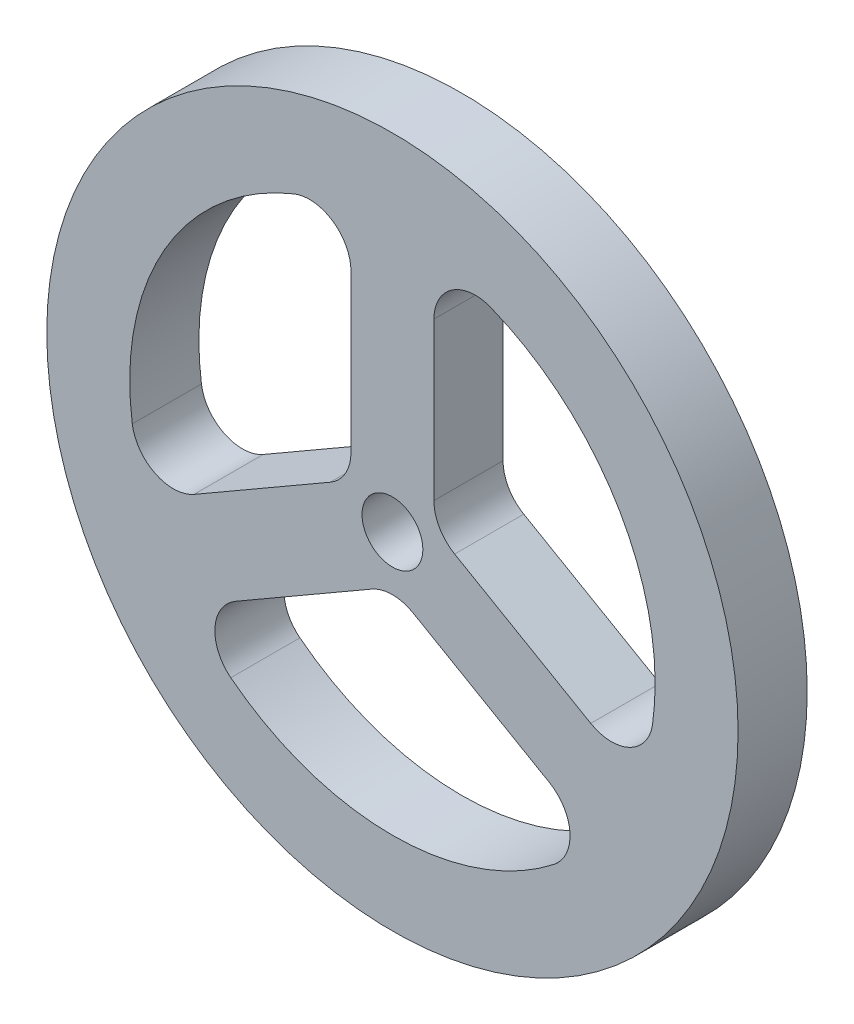
ISO-10303-21;
HEADER;
FILE_DESCRIPTION(('STEP AP214'),'2;1');
FILE_NAME('part.step','',(''),(''),'','','');
FILE_SCHEMA(('AUTOMOTIVE_DESIGN { 1 0 10303 214 1 1 1 1 }'));
ENDSEC;
DATA;
#1=APPLICATION_CONTEXT('core data for automotive mechanical design processes');
#2=APPLICATION_PROTOCOL_DEFINITION('international standard','automotive_design',2000,#1);
#3=PRODUCT_CONTEXT('',#1,'mechanical');
#4=PRODUCT('Part','Part','',(#3));
#5=PRODUCT_RELATED_PRODUCT_CATEGORY('part','',(#4));
#6=PRODUCT_DEFINITION_FORMATION('','',#4);
#7=PRODUCT_DEFINITION_CONTEXT('part definition',#1,'design');
#8=PRODUCT_DEFINITION('design','',#6,#7);
#9=PRODUCT_DEFINITION_SHAPE('','',#8);
#10=(LENGTH_UNIT() NAMED_UNIT(*) SI_UNIT(.MILLI.,.METRE.));
#11=(NAMED_UNIT(*) PLANE_ANGLE_UNIT() SI_UNIT($,.RADIAN.));
#12=(NAMED_UNIT(*) SI_UNIT($,.STERADIAN.) SOLID_ANGLE_UNIT());
#13=UNCERTAINTY_MEASURE_WITH_UNIT(LENGTH_MEASURE(1.E-05),#10,'distance_accuracy_value','');
#14=(GEOMETRIC_REPRESENTATION_CONTEXT(3) GLOBAL_UNCERTAINTY_ASSIGNED_CONTEXT((#13)) GLOBAL_UNIT_ASSIGNED_CONTEXT((#10,
#11,#12)) REPRESENTATION_CONTEXT('',''));
#15=CARTESIAN_POINT('',(0.,0.,0.));
#16=DIRECTION('',(0.,0.,1.));
#17=DIRECTION('',(1.,0.,0.));
#18=AXIS2_PLACEMENT_3D('',#15,#16,#17);
#19=CARTESIAN_POINT('',(0.,0.,6.35));
#20=DIRECTION('',(0.,0.,-1.));
#21=DIRECTION('',(-1.,0.,0.));
#22=AXIS2_PLACEMENT_3D('',#19,#20,#21);
#23=CYLINDRICAL_SURFACE('',#22,24.13);
#24=CARTESIAN_POINT('',(0.,0.,0.));
#25=DIRECTION('',(0.,0.,1.));
#26=DIRECTION('',(1.,0.,0.));
#27=AXIS2_PLACEMENT_3D('',#24,#25,#26);
#28=CIRCLE('',#27,24.13);
#29=CARTESIAN_POINT('',(-14.8478413826994,-19.0210017158456,0.));
#30=VERTEX_POINT('',#29);
#31=CARTESIAN_POINT('',(14.8478413826994,-19.0210017158456,0.));
#32=VERTEX_POINT('',#31);
#33=EDGE_CURVE('E206',#30,#32,#28,.T.);
#34=ORIENTED_EDGE('',*,*,#33,.F.);
#35=DIRECTION('',(0.,0.,-1.));
#36=VECTOR('',#35,1.);
#37=CARTESIAN_POINT('',(-14.8478413826994,-19.0210017158456,6.35));
#38=LINE('',#37,#36);
#39=CARTESIAN_POINT('',(-14.8478413826994,-19.0210017158456,6.35));
#40=VERTEX_POINT('',#39);
#41=EDGE_CURVE('E226',#30,#40,#38,.F.);
#42=ORIENTED_EDGE('',*,*,#41,.T.);
#43=CARTESIAN_POINT('',(0.,0.,6.35));
#44=DIRECTION('',(0.,0.,1.));
#45=DIRECTION('',(1.,0.,0.));
#46=AXIS2_PLACEMENT_3D('',#43,#44,#45);
#47=CIRCLE('',#46,24.13);
#48=CARTESIAN_POINT('',(14.8478413826994,-19.0210017158456,6.35));
#49=VERTEX_POINT('',#48);
#50=EDGE_CURVE('E348',#40,#49,#47,.T.);
#51=ORIENTED_EDGE('',*,*,#50,.T.);
#52=DIRECTION('',(0.,0.,-1.));
#53=VECTOR('',#52,1.);
#54=CARTESIAN_POINT('',(14.8478413826994,-19.0210017158456,6.35));
#55=LINE('',#54,#53);
#56=EDGE_CURVE('E222',#49,#32,#55,.T.);
#57=ORIENTED_EDGE('',*,*,#56,.T.);
#58=EDGE_LOOP('',(#34,#42,#51,#57));
#59=FACE_BOUND('',#58,.T.);
#60=ADVANCED_FACE('F41',(#59),#23,.F.);
#61=CARTESIAN_POINT('',(1.905,-3.29955678841871,6.35));
#62=DIRECTION('',(0.5,-0.866025403784439,0.));
#63=DIRECTION('',(0.866025403784439,0.5,0.));
#64=AXIS2_PLACEMENT_3D('',#61,#62,#63);
#65=PLANE('',#64);
#66=DIRECTION('',(-0.866025403784439,-0.5,0.));
#67=VECTOR('',#66,1.);
#68=CARTESIAN_POINT('',(1.905,-3.29955678841871,0.));
#69=LINE('',#68,#67);
#70=CARTESIAN_POINT('',(-1.905,-5.49926131403119,0.));
#71=VERTEX_POINT('',#70);
#72=CARTESIAN_POINT('',(-14.4084453749047,-12.7181288670302,0.));
#73=VERTEX_POINT('',#72);
#74=EDGE_CURVE('E199',#71,#73,#69,.T.);
#75=ORIENTED_EDGE('',*,*,#74,.F.);
#76=DIRECTION('',(0.,0.,-1.));
#77=VECTOR('',#76,1.);
#78=CARTESIAN_POINT('',(-1.905,-5.49926131403118,6.35));
#79=LINE('',#78,#77);
#80=CARTESIAN_POINT('',(-1.905,-5.49926131403119,6.35));
#81=VERTEX_POINT('',#80);
#82=EDGE_CURVE('E173',#71,#81,#79,.F.);
#83=ORIENTED_EDGE('',*,*,#82,.T.);
#84=DIRECTION('',(-0.866025403784439,-0.5,0.));
#85=VECTOR('',#84,1.);
#86=CARTESIAN_POINT('',(1.905,-3.29955678841871,6.35));
#87=LINE('',#86,#85);
#88=CARTESIAN_POINT('',(-14.4084453749047,-12.7181288670302,6.35));
#89=VERTEX_POINT('',#88);
#90=EDGE_CURVE('E357',#81,#89,#87,.T.);
#91=ORIENTED_EDGE('',*,*,#90,.T.);
#92=DIRECTION('',(0.,0.,1.));
#93=VECTOR('',#92,1.);
#94=CARTESIAN_POINT('',(-14.4084453749047,-12.7181288670302,0.));
#95=LINE('',#94,#93);
#96=EDGE_CURVE('E190',#89,#73,#95,.F.);
#97=ORIENTED_EDGE('',*,*,#96,.T.);
#98=EDGE_LOOP('',(#75,#83,#91,#97));
#99=FACE_BOUND('',#98,.T.);
#100=ADVANCED_FACE('F399',(#99),#65,.T.);
#101=CARTESIAN_POINT('',(0.,0.,6.35));
#102=DIRECTION('',(0.,0.,-1.));
#103=DIRECTION('',(-1.,0.,0.));
#104=AXIS2_PLACEMENT_3D('',#101,#102,#103);
#105=CYLINDRICAL_SURFACE('',#104,24.13);
#106=CARTESIAN_POINT('',(0.,0.,6.35));
#107=DIRECTION('',(0.,0.,1.));
#108=DIRECTION('',(1.,0.,0.));
#109=AXIS2_PLACEMENT_3D('',#106,#107,#108);
#110=CIRCLE('',#109,24.13);
#111=CARTESIAN_POINT('',(23.8965913826993,-3.3481069708567,6.35));
#112=VERTEX_POINT('',#111);
#113=CARTESIAN_POINT('',(9.04875,22.3691086867023,6.35));
#114=VERTEX_POINT('',#113);
#115=EDGE_CURVE('E338',#112,#114,#110,.T.);
#116=ORIENTED_EDGE('',*,*,#115,.T.);
#117=DIRECTION('',(0.,0.,-1.));
#118=VECTOR('',#117,1.);
#119=CARTESIAN_POINT('',(9.04875,22.3691086867023,6.35));
#120=LINE('',#119,#118);
#121=CARTESIAN_POINT('',(9.04875,22.3691086867023,0.));
#122=VERTEX_POINT('',#121);
#123=EDGE_CURVE('E232',#114,#122,#120,.T.);
#124=ORIENTED_EDGE('',*,*,#123,.T.);
#125=CARTESIAN_POINT('',(0.,0.,0.));
#126=DIRECTION('',(0.,0.,1.));
#127=DIRECTION('',(1.,0.,0.));
#128=AXIS2_PLACEMENT_3D('',#125,#126,#127);
#129=CIRCLE('',#128,24.13);
#130=CARTESIAN_POINT('',(23.8965913826993,-3.3481069708567,0.));
#131=VERTEX_POINT('',#130);
#132=EDGE_CURVE('E316',#131,#122,#129,.T.);
#133=ORIENTED_EDGE('',*,*,#132,.F.);
#134=DIRECTION('',(0.,0.,-1.));
#135=VECTOR('',#134,1.);
#136=CARTESIAN_POINT('',(23.8965913826993,-3.3481069708567,6.35));
#137=LINE('',#136,#135);
#138=EDGE_CURVE('E229',#131,#112,#137,.F.);
#139=ORIENTED_EDGE('',*,*,#138,.T.);
#140=EDGE_LOOP('',(#116,#124,#133,#139));
#141=FACE_BOUND('',#140,.T.);
#142=ADVANCED_FACE('F324',(#141),#105,.F.);
#143=CARTESIAN_POINT('',(1.905,3.29955678841871,6.35));
#144=DIRECTION('',(0.5,0.866025403784439,0.));
#145=DIRECTION('',(-0.866025403784439,0.5,0.));
#146=AXIS2_PLACEMENT_3D('',#143,#144,#145);
#147=PLANE('',#146);
#148=DIRECTION('',(0.866025403784439,-0.5,0.));
#149=VECTOR('',#148,1.);
#150=CARTESIAN_POINT('',(1.905,3.29955678841871,0.));
#151=LINE('',#150,#149);
#152=CARTESIAN_POINT('',(5.715,1.09985226280624,0.));
#153=VERTEX_POINT('',#152);
#154=CARTESIAN_POINT('',(18.2184453749047,-6.11901529019278,0.));
#155=VERTEX_POINT('',#154);
#156=EDGE_CURVE('E318',#153,#155,#151,.T.);
#157=ORIENTED_EDGE('',*,*,#156,.F.);
#158=DIRECTION('',(0.,0.,-1.));
#159=VECTOR('',#158,1.);
#160=CARTESIAN_POINT('',(5.715,1.09985226280624,6.35));
#161=LINE('',#160,#159);
#162=CARTESIAN_POINT('',(5.715,1.09985226280624,6.35));
#163=VERTEX_POINT('',#162);
#164=EDGE_CURVE('E247',#153,#163,#161,.F.);
#165=ORIENTED_EDGE('',*,*,#164,.T.);
#166=DIRECTION('',(0.866025403784439,-0.5,0.));
#167=VECTOR('',#166,1.);
#168=CARTESIAN_POINT('',(1.905,3.29955678841871,6.35));
#169=LINE('',#168,#167);
#170=CARTESIAN_POINT('',(18.2184453749047,-6.11901529019278,6.35));
#171=VERTEX_POINT('',#170);
#172=EDGE_CURVE('E336',#163,#171,#169,.T.);
#173=ORIENTED_EDGE('',*,*,#172,.T.);
#174=DIRECTION('',(0.,0.,1.));
#175=VECTOR('',#174,1.);
#176=CARTESIAN_POINT('',(18.2184453749047,-6.11901529019278,0.));
#177=LINE('',#176,#175);
#178=EDGE_CURVE('E243',#171,#155,#177,.F.);
#179=ORIENTED_EDGE('',*,*,#178,.T.);
#180=EDGE_LOOP('',(#157,#165,#173,#179));
#181=FACE_BOUND('',#180,.T.);
#182=ADVANCED_FACE('F340',(#181),#147,.T.);
#183=CARTESIAN_POINT('',(0.,0.,6.35));
#184=DIRECTION('',(0.,0.,-1.));
#185=DIRECTION('',(-1.,0.,0.));
#186=AXIS2_PLACEMENT_3D('',#183,#184,#185);
#187=CYLINDRICAL_SURFACE('',#186,24.13);
#188=CARTESIAN_POINT('',(0.,0.,6.35));
#189=DIRECTION('',(0.,0.,1.));
#190=DIRECTION('',(1.,0.,0.));
#191=AXIS2_PLACEMENT_3D('',#188,#189,#190);
#192=CIRCLE('',#191,24.13);
#193=CARTESIAN_POINT('',(-9.04875,22.3691086867023,6.35));
#194=VERTEX_POINT('',#193);
#195=CARTESIAN_POINT('',(-23.8965913826993,-3.34810697085672,6.35));
#196=VERTEX_POINT('',#195);
#197=EDGE_CURVE('E213',#194,#196,#192,.T.);
#198=ORIENTED_EDGE('',*,*,#197,.T.);
#199=DIRECTION('',(0.,0.,-1.));
#200=VECTOR('',#199,1.);
#201=CARTESIAN_POINT('',(-23.8965913826993,-3.34810697085672,6.35));
#202=LINE('',#201,#200);
#203=CARTESIAN_POINT('',(-23.8965913826993,-3.34810697085672,0.));
#204=VERTEX_POINT('',#203);
#205=EDGE_CURVE('E253',#196,#204,#202,.T.);
#206=ORIENTED_EDGE('',*,*,#205,.T.);
#207=CARTESIAN_POINT('',(0.,0.,0.));
#208=DIRECTION('',(0.,0.,1.));
#209=DIRECTION('',(1.,0.,0.));
#210=AXIS2_PLACEMENT_3D('',#207,#208,#209);
#211=CIRCLE('',#210,24.13);
#212=CARTESIAN_POINT('',(-9.04875,22.3691086867023,0.));
#213=VERTEX_POINT('',#212);
#214=EDGE_CURVE('E370',#213,#204,#211,.T.);
#215=ORIENTED_EDGE('',*,*,#214,.F.);
#216=DIRECTION('',(0.,0.,-1.));
#217=VECTOR('',#216,1.);
#218=CARTESIAN_POINT('',(-9.04875,22.3691086867023,6.35));
#219=LINE('',#218,#217);
#220=EDGE_CURVE('E250',#213,#194,#219,.F.);
#221=ORIENTED_EDGE('',*,*,#220,.T.);
#222=EDGE_LOOP('',(#198,#206,#215,#221));
#223=FACE_BOUND('',#222,.T.);
#224=ADVANCED_FACE('F417',(#223),#187,.F.);
#225=CARTESIAN_POINT('',(-3.81,0.,6.35));
#226=DIRECTION('',(-1.,0.,0.));
#227=DIRECTION('',(0.,-1.,0.));
#228=AXIS2_PLACEMENT_3D('',#225,#226,#227);
#229=PLANE('',#228);
#230=DIRECTION('',(0.,1.,0.));
#231=VECTOR('',#230,1.);
#232=CARTESIAN_POINT('',(-3.81,0.,0.));
#233=LINE('',#232,#231);
#234=CARTESIAN_POINT('',(-3.81,4.39940905122495,0.));
#235=VERTEX_POINT('',#234);
#236=CARTESIAN_POINT('',(-3.81,18.837144157223,0.));
#237=VERTEX_POINT('',#236);
#238=EDGE_CURVE('E374',#235,#237,#233,.T.);
#239=ORIENTED_EDGE('',*,*,#238,.F.);
#240=DIRECTION('',(0.,0.,-1.));
#241=VECTOR('',#240,1.);
#242=CARTESIAN_POINT('',(-3.81,4.39940905122495,6.35));
#243=LINE('',#242,#241);
#244=CARTESIAN_POINT('',(-3.81,4.39940905122495,6.35));
#245=VERTEX_POINT('',#244);
#246=EDGE_CURVE('E64',#235,#245,#243,.F.);
#247=ORIENTED_EDGE('',*,*,#246,.T.);
#248=DIRECTION('',(0.,1.,0.));
#249=VECTOR('',#248,1.);
#250=CARTESIAN_POINT('',(-3.81,0.,6.35));
#251=LINE('',#250,#249);
#252=CARTESIAN_POINT('',(-3.81,18.837144157223,6.35));
#253=VERTEX_POINT('',#252);
#254=EDGE_CURVE('E630',#245,#253,#251,.T.);
#255=ORIENTED_EDGE('',*,*,#254,.T.);
#256=DIRECTION('',(0.,0.,1.));
#257=VECTOR('',#256,1.);
#258=CARTESIAN_POINT('',(-3.81,18.837144157223,0.));
#259=LINE('',#258,#257);
#260=EDGE_CURVE('E264',#253,#237,#259,.F.);
#261=ORIENTED_EDGE('',*,*,#260,.T.);
#262=EDGE_LOOP('',(#239,#247,#255,#261));
#263=FACE_BOUND('',#262,.T.);
#264=ADVANCED_FACE('F423',(#263),#229,.T.);
#265=CARTESIAN_POINT('',(0.,0.,6.35));
#266=DIRECTION('',(0.,0.,-1.));
#267=DIRECTION('',(-1.,0.,0.));
#268=AXIS2_PLACEMENT_3D('',#265,#266,#267);
#269=CYLINDRICAL_SURFACE('',#268,2.794);
#270=CARTESIAN_POINT('',(0.,0.,6.35));
#271=DIRECTION('',(0.,0.,1.));
#272=DIRECTION('',(1.,0.,0.));
#273=AXIS2_PLACEMENT_3D('',#270,#271,#272);
#274=CIRCLE('',#273,2.794);
#275=CARTESIAN_POINT('',(2.794,0.,6.35));
#276=VERTEX_POINT('',#275);
#277=EDGE_CURVE('E363',#276,#276,#274,.T.);
#278=ORIENTED_EDGE('',*,*,#277,.T.);
#279=EDGE_LOOP('',(#278));
#280=FACE_BOUND('',#279,.T.);
#281=CARTESIAN_POINT('',(0.,0.,0.));
#282=DIRECTION('',(0.,0.,1.));
#283=DIRECTION('',(1.,0.,0.));
#284=AXIS2_PLACEMENT_3D('',#281,#282,#283);
#285=CIRCLE('',#284,2.794);
#286=CARTESIAN_POINT('',(2.794,0.,0.));
#287=VERTEX_POINT('',#286);
#288=EDGE_CURVE('E198',#287,#287,#285,.T.);
#289=ORIENTED_EDGE('',*,*,#288,.F.);
#290=EDGE_LOOP('',(#289));
#291=FACE_BOUND('',#290,.T.);
#292=ADVANCED_FACE('F426',(#280,#291),#269,.F.);
#293=CARTESIAN_POINT('',(-1.905,-3.29955678841871,6.35));
#294=DIRECTION('',(0.5,0.866025403784439,0.));
#295=DIRECTION('',(-0.866025403784439,0.5,0.));
#296=AXIS2_PLACEMENT_3D('',#293,#294,#295);
#297=PLANE('',#296);
#298=DIRECTION('',(0.866025403784439,-0.5,0.));
#299=VECTOR('',#298,1.);
#300=CARTESIAN_POINT('',(-1.905,-3.29955678841871,6.35));
#301=LINE('',#300,#299);
#302=CARTESIAN_POINT('',(1.905,-5.49926131403118,6.35));
#303=VERTEX_POINT('',#302);
#304=CARTESIAN_POINT('',(14.4084453749047,-12.7181288670302,6.35));
#305=VERTEX_POINT('',#304);
#306=EDGE_CURVE('E188',#303,#305,#301,.T.);
#307=ORIENTED_EDGE('',*,*,#306,.F.);
#308=DIRECTION('',(0.,0.,-1.));
#309=VECTOR('',#308,1.);
#310=CARTESIAN_POINT('',(1.905,-5.49926131403118,6.35));
#311=LINE('',#310,#309);
#312=CARTESIAN_POINT('',(1.905,-5.49926131403118,0.));
#313=VERTEX_POINT('',#312);
#314=EDGE_CURVE('E172',#303,#313,#311,.T.);
#315=ORIENTED_EDGE('',*,*,#314,.T.);
#316=DIRECTION('',(0.866025403784439,-0.5,0.));
#317=VECTOR('',#316,1.);
#318=CARTESIAN_POINT('',(-1.905,-3.29955678841871,0.));
#319=LINE('',#318,#317);
#320=CARTESIAN_POINT('',(14.4084453749047,-12.7181288670302,0.));
#321=VERTEX_POINT('',#320);
#322=EDGE_CURVE('E185',#313,#321,#319,.T.);
#323=ORIENTED_EDGE('',*,*,#322,.T.);
#324=DIRECTION('',(0.,0.,-1.));
#325=VECTOR('',#324,1.);
#326=CARTESIAN_POINT('',(14.4084453749047,-12.7181288670302,6.35));
#327=LINE('',#326,#325);
#328=EDGE_CURVE('E191',#321,#305,#327,.F.);
#329=ORIENTED_EDGE('',*,*,#328,.T.);
#330=EDGE_LOOP('',(#307,#315,#323,#329));
#331=FACE_BOUND('',#330,.T.);
#332=ADVANCED_FACE('F184',(#331),#297,.F.);
#333=CARTESIAN_POINT('',(3.81,0.,6.35));
#334=DIRECTION('',(-1.,0.,0.));
#335=DIRECTION('',(0.,0.,1.));
#336=AXIS2_PLACEMENT_3D('',#333,#334,#335);
#337=PLANE('',#336);
#338=DIRECTION('',(0.,1.,0.));
#339=VECTOR('',#338,1.);
#340=CARTESIAN_POINT('',(3.81,0.,0.));
#341=LINE('',#340,#339);
#342=CARTESIAN_POINT('',(3.81,4.39940905122495,0.));
#343=VERTEX_POINT('',#342);
#344=CARTESIAN_POINT('',(3.81,18.837144157223,0.));
#345=VERTEX_POINT('',#344);
#346=EDGE_CURVE('E383',#343,#345,#341,.T.);
#347=ORIENTED_EDGE('',*,*,#346,.T.);
#348=DIRECTION('',(0.,0.,-1.));
#349=VECTOR('',#348,1.);
#350=CARTESIAN_POINT('',(3.81,18.837144157223,6.35));
#351=LINE('',#350,#349);
#352=CARTESIAN_POINT('',(3.81,18.837144157223,6.35));
#353=VERTEX_POINT('',#352);
#354=EDGE_CURVE('E240',#345,#353,#351,.F.);
#355=ORIENTED_EDGE('',*,*,#354,.T.);
#356=DIRECTION('',(0.,1.,0.));
#357=VECTOR('',#356,1.);
#358=CARTESIAN_POINT('',(3.81,0.,6.35));
#359=LINE('',#358,#357);
#360=CARTESIAN_POINT('',(3.81,4.39940905122495,6.35));
#361=VERTEX_POINT('',#360);
#362=EDGE_CURVE('E343',#361,#353,#359,.T.);
#363=ORIENTED_EDGE('',*,*,#362,.F.);
#364=DIRECTION('',(0.,0.,-1.));
#365=VECTOR('',#364,1.);
#366=CARTESIAN_POINT('',(3.81,4.39940905122495,6.35));
#367=LINE('',#366,#365);
#368=EDGE_CURVE('E236',#361,#343,#367,.T.);
#369=ORIENTED_EDGE('',*,*,#368,.T.);
#370=EDGE_LOOP('',(#347,#355,#363,#369));
#371=FACE_BOUND('',#370,.T.);
#372=ADVANCED_FACE('F411',(#371),#337,.F.);
#373=CARTESIAN_POINT('',(-1.905,3.29955678841871,6.35));
#374=DIRECTION('',(0.5,-0.866025403784438,0.));
#375=DIRECTION('',(0.866025403784439,0.5,0.));
#376=AXIS2_PLACEMENT_3D('',#373,#374,#375);
#377=PLANE('',#376);
#378=DIRECTION('',(-0.866025403784439,-0.5,0.));
#379=VECTOR('',#378,1.);
#380=CARTESIAN_POINT('',(-1.905,3.29955678841871,0.));
#381=LINE('',#380,#379);
#382=CARTESIAN_POINT('',(-5.715,1.09985226280624,0.));
#383=VERTEX_POINT('',#382);
#384=CARTESIAN_POINT('',(-18.2184453749047,-6.11901529019278,0.));
#385=VERTEX_POINT('',#384);
#386=EDGE_CURVE('E328',#383,#385,#381,.T.);
#387=ORIENTED_EDGE('',*,*,#386,.T.);
#388=DIRECTION('',(0.,0.,-1.));
#389=VECTOR('',#388,1.);
#390=CARTESIAN_POINT('',(-18.2184453749047,-6.11901529019278,6.35));
#391=LINE('',#390,#389);
#392=CARTESIAN_POINT('',(-18.2184453749047,-6.11901529019278,6.35));
#393=VERTEX_POINT('',#392);
#394=EDGE_CURVE('E261',#385,#393,#391,.F.);
#395=ORIENTED_EDGE('',*,*,#394,.T.);
#396=DIRECTION('',(-0.866025403784439,-0.5,0.));
#397=VECTOR('',#396,1.);
#398=CARTESIAN_POINT('',(-1.905,3.29955678841871,6.35));
#399=LINE('',#398,#397);
#400=CARTESIAN_POINT('',(-5.715,1.09985226280624,6.35));
#401=VERTEX_POINT('',#400);
#402=EDGE_CURVE('E350',#401,#393,#399,.T.);
#403=ORIENTED_EDGE('',*,*,#402,.F.);
#404=DIRECTION('',(0.,0.,-1.));
#405=VECTOR('',#404,1.);
#406=CARTESIAN_POINT('',(-5.715,1.09985226280624,6.35));
#407=LINE('',#406,#405);
#408=EDGE_CURVE('E257',#401,#383,#407,.T.);
#409=ORIENTED_EDGE('',*,*,#408,.T.);
#410=EDGE_LOOP('',(#387,#395,#403,#409));
#411=FACE_BOUND('',#410,.T.);
#412=ADVANCED_FACE('F414',(#411),#377,.F.);
#413=CARTESIAN_POINT('',(0.,0.,6.35));
#414=DIRECTION('',(0.,0.,-1.));
#415=DIRECTION('',(-1.,0.,0.));
#416=AXIS2_PLACEMENT_3D('',#413,#414,#415);
#417=CYLINDRICAL_SURFACE('',#416,31.75);
#418=CARTESIAN_POINT('',(0.,0.,6.35));
#419=DIRECTION('',(0.,0.,1.));
#420=DIRECTION('',(1.,0.,0.));
#421=AXIS2_PLACEMENT_3D('',#418,#419,#420);
#422=CIRCLE('',#421,31.75);
#423=CARTESIAN_POINT('',(31.75,0.,6.35));
#424=VERTEX_POINT('',#423);
#425=EDGE_CURVE('E215',#424,#424,#422,.T.);
#426=ORIENTED_EDGE('',*,*,#425,.F.);
#427=EDGE_LOOP('',(#426));
#428=FACE_BOUND('',#427,.T.);
#429=CARTESIAN_POINT('',(0.,0.,0.));
#430=DIRECTION('',(0.,0.,1.));
#431=DIRECTION('',(1.,0.,0.));
#432=AXIS2_PLACEMENT_3D('',#429,#430,#431);
#433=CIRCLE('',#432,31.75);
#434=CARTESIAN_POINT('',(31.75,0.,0.));
#435=VERTEX_POINT('',#434);
#436=EDGE_CURVE('E204',#435,#435,#433,.T.);
#437=ORIENTED_EDGE('',*,*,#436,.T.);
#438=EDGE_LOOP('',(#437));
#439=FACE_BOUND('',#438,.T.);
#440=ADVANCED_FACE('F421',(#428,#439),#417,.T.);
#441=CARTESIAN_POINT('',(0.,0.,6.35));
#442=DIRECTION('',(0.,0.,1.));
#443=DIRECTION('',(1.,0.,0.));
#444=AXIS2_PLACEMENT_3D('',#441,#442,#443);
#445=PLANE('',#444);
#446=ORIENTED_EDGE('',*,*,#197,.F.);
#447=CARTESIAN_POINT('',(-7.62,18.837144157223,6.35));
#448=DIRECTION('',(0.,0.,1.));
#449=DIRECTION('',(1.,0.,0.));
#450=AXIS2_PLACEMENT_3D('',#447,#448,#449);
#451=CIRCLE('',#450,3.81);
#452=EDGE_CURVE('E57',#194,#253,#451,.F.);
#453=ORIENTED_EDGE('',*,*,#452,.T.);
#454=ORIENTED_EDGE('',*,*,#254,.F.);
#455=CARTESIAN_POINT('',(-7.62,4.39940905122495,6.35));
#456=DIRECTION('',(0.,0.,1.));
#457=DIRECTION('',(1.,0.,0.));
#458=AXIS2_PLACEMENT_3D('',#455,#456,#457);
#459=CIRCLE('',#458,3.81);
#460=EDGE_CURVE('E299',#245,#401,#459,.F.);
#461=ORIENTED_EDGE('',*,*,#460,.T.);
#462=ORIENTED_EDGE('',*,*,#402,.T.);
#463=CARTESIAN_POINT('',(-20.1234453749047,-2.81945850177408,6.35));
#464=DIRECTION('',(0.,0.,1.));
#465=DIRECTION('',(1.,0.,0.));
#466=AXIS2_PLACEMENT_3D('',#463,#464,#465);
#467=CIRCLE('',#466,3.81);
#468=EDGE_CURVE('E293',#393,#196,#467,.F.);
#469=ORIENTED_EDGE('',*,*,#468,.T.);
#470=EDGE_LOOP('',(#446,#453,#454,#461,#462,#469));
#471=FACE_BOUND('',#470,.T.);
#472=ORIENTED_EDGE('',*,*,#115,.F.);
#473=CARTESIAN_POINT('',(20.1234453749047,-2.81945850177406,6.35));
#474=DIRECTION('',(0.,0.,1.));
#475=DIRECTION('',(1.,0.,0.));
#476=AXIS2_PLACEMENT_3D('',#473,#474,#475);
#477=CIRCLE('',#476,3.81);
#478=EDGE_CURVE('E11',#112,#171,#477,.F.);
#479=ORIENTED_EDGE('',*,*,#478,.T.);
#480=ORIENTED_EDGE('',*,*,#172,.F.);
#481=CARTESIAN_POINT('',(7.62,4.39940905122495,6.35));
#482=DIRECTION('',(0.,0.,1.));
#483=DIRECTION('',(1.,0.,0.));
#484=AXIS2_PLACEMENT_3D('',#481,#482,#483);
#485=CIRCLE('',#484,3.81);
#486=EDGE_CURVE('E287',#163,#361,#485,.F.);
#487=ORIENTED_EDGE('',*,*,#486,.T.);
#488=ORIENTED_EDGE('',*,*,#362,.T.);
#489=CARTESIAN_POINT('',(7.62,18.837144157223,6.35));
#490=DIRECTION('',(0.,0.,1.));
#491=DIRECTION('',(1.,0.,0.));
#492=AXIS2_PLACEMENT_3D('',#489,#490,#491);
#493=CIRCLE('',#492,3.81);
#494=EDGE_CURVE('E281',#353,#114,#493,.F.);
#495=ORIENTED_EDGE('',*,*,#494,.T.);
#496=EDGE_LOOP('',(#472,#479,#480,#487,#488,#495));
#497=FACE_BOUND('',#496,.T.);
#498=ORIENTED_EDGE('',*,*,#50,.F.);
#499=CARTESIAN_POINT('',(-12.5034453749047,-16.0176856554489,6.35));
#500=DIRECTION('',(0.,0.,1.));
#501=DIRECTION('',(1.,0.,0.));
#502=AXIS2_PLACEMENT_3D('',#499,#500,#501);
#503=CIRCLE('',#502,3.81);
#504=EDGE_CURVE('E275',#40,#89,#503,.F.);
#505=ORIENTED_EDGE('',*,*,#504,.T.);
#506=ORIENTED_EDGE('',*,*,#90,.F.);
#507=CARTESIAN_POINT('',(0.,-8.7988181024499,6.35));
#508=DIRECTION('',(0.,0.,1.));
#509=DIRECTION('',(1.,0.,0.));
#510=AXIS2_PLACEMENT_3D('',#507,#508,#509);
#511=CIRCLE('',#510,3.81);
#512=EDGE_CURVE('E179',#81,#303,#511,.F.);
#513=ORIENTED_EDGE('',*,*,#512,.T.);
#514=ORIENTED_EDGE('',*,*,#306,.T.);
#515=CARTESIAN_POINT('',(12.5034453749047,-16.0176856554489,6.35));
#516=DIRECTION('',(0.,0.,1.));
#517=DIRECTION('',(1.,0.,0.));
#518=AXIS2_PLACEMENT_3D('',#515,#516,#517);
#519=CIRCLE('',#518,3.81);
#520=EDGE_CURVE('E309',#305,#49,#519,.F.);
#521=ORIENTED_EDGE('',*,*,#520,.T.);
#522=EDGE_LOOP('',(#498,#505,#506,#513,#514,#521));
#523=FACE_BOUND('',#522,.T.);
#524=ORIENTED_EDGE('',*,*,#277,.F.);
#525=EDGE_LOOP('',(#524));
#526=FACE_BOUND('',#525,.T.);
#527=ORIENTED_EDGE('',*,*,#425,.T.);
#528=EDGE_LOOP('',(#527));
#529=FACE_BOUND('',#528,.T.);
#530=ADVANCED_FACE('F334',(#471,#497,#523,#526,#529),#445,.T.);
#531=CARTESIAN_POINT('',(0.,0.,0.));
#532=DIRECTION('',(0.,0.,1.));
#533=DIRECTION('',(1.,0.,0.));
#534=AXIS2_PLACEMENT_3D('',#531,#532,#533);
#535=PLANE('',#534);
#536=ORIENTED_EDGE('',*,*,#238,.T.);
#537=CARTESIAN_POINT('',(-7.62,18.837144157223,0.));
#538=DIRECTION('',(0.,0.,1.));
#539=DIRECTION('',(1.,0.,0.));
#540=AXIS2_PLACEMENT_3D('',#537,#538,#539);
#541=CIRCLE('',#540,3.81);
#542=EDGE_CURVE('E302',#237,#213,#541,.T.);
#543=ORIENTED_EDGE('',*,*,#542,.T.);
#544=ORIENTED_EDGE('',*,*,#214,.T.);
#545=CARTESIAN_POINT('',(-20.1234453749047,-2.81945850177408,0.));
#546=DIRECTION('',(0.,0.,1.));
#547=DIRECTION('',(1.,0.,0.));
#548=AXIS2_PLACEMENT_3D('',#545,#546,#547);
#549=CIRCLE('',#548,3.81);
#550=EDGE_CURVE('E290',#204,#385,#549,.T.);
#551=ORIENTED_EDGE('',*,*,#550,.T.);
#552=ORIENTED_EDGE('',*,*,#386,.F.);
#553=CARTESIAN_POINT('',(-7.62,4.39940905122495,0.));
#554=DIRECTION('',(0.,0.,1.));
#555=DIRECTION('',(1.,0.,0.));
#556=AXIS2_PLACEMENT_3D('',#553,#554,#555);
#557=CIRCLE('',#556,3.81);
#558=EDGE_CURVE('E296',#383,#235,#557,.T.);
#559=ORIENTED_EDGE('',*,*,#558,.T.);
#560=EDGE_LOOP('',(#536,#543,#544,#551,#552,#559));
#561=FACE_BOUND('',#560,.T.);
#562=ORIENTED_EDGE('',*,*,#156,.T.);
#563=CARTESIAN_POINT('',(20.1234453749047,-2.81945850177406,0.));
#564=DIRECTION('',(0.,0.,1.));
#565=DIRECTION('',(1.,0.,0.));
#566=AXIS2_PLACEMENT_3D('',#563,#564,#565);
#567=CIRCLE('',#566,3.81);
#568=EDGE_CURVE('E50',#155,#131,#567,.T.);
#569=ORIENTED_EDGE('',*,*,#568,.T.);
#570=ORIENTED_EDGE('',*,*,#132,.T.);
#571=CARTESIAN_POINT('',(7.62,18.837144157223,0.));
#572=DIRECTION('',(0.,0.,1.));
#573=DIRECTION('',(1.,0.,0.));
#574=AXIS2_PLACEMENT_3D('',#571,#572,#573);
#575=CIRCLE('',#574,3.81);
#576=EDGE_CURVE('E278',#122,#345,#575,.T.);
#577=ORIENTED_EDGE('',*,*,#576,.T.);
#578=ORIENTED_EDGE('',*,*,#346,.F.);
#579=CARTESIAN_POINT('',(7.62,4.39940905122495,0.));
#580=DIRECTION('',(0.,0.,1.));
#581=DIRECTION('',(1.,0.,0.));
#582=AXIS2_PLACEMENT_3D('',#579,#580,#581);
#583=CIRCLE('',#582,3.81);
#584=EDGE_CURVE('E284',#343,#153,#583,.T.);
#585=ORIENTED_EDGE('',*,*,#584,.T.);
#586=EDGE_LOOP('',(#562,#569,#570,#577,#578,#585));
#587=FACE_BOUND('',#586,.T.);
#588=ORIENTED_EDGE('',*,*,#74,.T.);
#589=CARTESIAN_POINT('',(-12.5034453749047,-16.0176856554489,0.));
#590=DIRECTION('',(0.,0.,1.));
#591=DIRECTION('',(1.,0.,0.));
#592=AXIS2_PLACEMENT_3D('',#589,#590,#591);
#593=CIRCLE('',#592,3.81);
#594=EDGE_CURVE('E272',#73,#30,#593,.T.);
#595=ORIENTED_EDGE('',*,*,#594,.T.);
#596=ORIENTED_EDGE('',*,*,#33,.T.);
#597=CARTESIAN_POINT('',(12.5034453749047,-16.0176856554489,0.));
#598=DIRECTION('',(0.,0.,1.));
#599=DIRECTION('',(1.,0.,0.));
#600=AXIS2_PLACEMENT_3D('',#597,#598,#599);
#601=CIRCLE('',#600,3.81);
#602=EDGE_CURVE('E196',#32,#321,#601,.T.);
#603=ORIENTED_EDGE('',*,*,#602,.T.);
#604=ORIENTED_EDGE('',*,*,#322,.F.);
#605=CARTESIAN_POINT('',(0.,-8.7988181024499,0.));
#606=DIRECTION('',(0.,0.,1.));
#607=DIRECTION('',(1.,0.,0.));
#608=AXIS2_PLACEMENT_3D('',#605,#606,#607);
#609=CIRCLE('',#608,3.81);
#610=EDGE_CURVE('E168',#313,#71,#609,.T.);
#611=ORIENTED_EDGE('',*,*,#610,.T.);
#612=EDGE_LOOP('',(#588,#595,#596,#603,#604,#611));
#613=FACE_BOUND('',#612,.T.);
#614=ORIENTED_EDGE('',*,*,#288,.T.);
#615=EDGE_LOOP('',(#614));
#616=FACE_BOUND('',#615,.T.);
#617=ORIENTED_EDGE('',*,*,#436,.F.);
#618=EDGE_LOOP('',(#617));
#619=FACE_BOUND('',#618,.T.);
#620=ADVANCED_FACE('F193',(#561,#587,#613,#616,#619),#535,.F.);
#621=CARTESIAN_POINT('',(0.,-8.7988181024499,6.35));
#622=DIRECTION('',(0.,0.,-1.));
#623=DIRECTION('',(-1.,0.,0.));
#624=AXIS2_PLACEMENT_3D('',#621,#622,#623);
#625=CYLINDRICAL_SURFACE('',#624,3.81);
#626=ORIENTED_EDGE('',*,*,#512,.F.);
#627=ORIENTED_EDGE('',*,*,#82,.F.);
#628=ORIENTED_EDGE('',*,*,#610,.F.);
#629=ORIENTED_EDGE('',*,*,#314,.F.);
#630=EDGE_LOOP('',(#626,#627,#628,#629));
#631=FACE_BOUND('',#630,.T.);
#632=ADVANCED_FACE('F171',(#631),#625,.F.);
#633=CARTESIAN_POINT('',(-12.5034453749047,-16.0176856554489,6.35));
#634=DIRECTION('',(0.,0.,-1.));
#635=DIRECTION('',(-1.,0.,0.));
#636=AXIS2_PLACEMENT_3D('',#633,#634,#635);
#637=CYLINDRICAL_SURFACE('',#636,3.81);
#638=ORIENTED_EDGE('',*,*,#504,.F.);
#639=ORIENTED_EDGE('',*,*,#41,.F.);
#640=ORIENTED_EDGE('',*,*,#594,.F.);
#641=ORIENTED_EDGE('',*,*,#96,.F.);
#642=EDGE_LOOP('',(#638,#639,#640,#641));
#643=FACE_BOUND('',#642,.T.);
#644=ADVANCED_FACE('F394',(#643),#637,.F.);
#645=CARTESIAN_POINT('',(7.62,18.837144157223,6.35));
#646=DIRECTION('',(0.,0.,-1.));
#647=DIRECTION('',(-1.,0.,0.));
#648=AXIS2_PLACEMENT_3D('',#645,#646,#647);
#649=CYLINDRICAL_SURFACE('',#648,3.81);
#650=ORIENTED_EDGE('',*,*,#494,.F.);
#651=ORIENTED_EDGE('',*,*,#354,.F.);
#652=ORIENTED_EDGE('',*,*,#576,.F.);
#653=ORIENTED_EDGE('',*,*,#123,.F.);
#654=EDGE_LOOP('',(#650,#651,#652,#653));
#655=FACE_BOUND('',#654,.T.);
#656=ADVANCED_FACE('F434',(#655),#649,.F.);
#657=CARTESIAN_POINT('',(7.62,4.39940905122495,6.35));
#658=DIRECTION('',(0.,0.,-1.));
#659=DIRECTION('',(-1.,0.,0.));
#660=AXIS2_PLACEMENT_3D('',#657,#658,#659);
#661=CYLINDRICAL_SURFACE('',#660,3.81);
#662=ORIENTED_EDGE('',*,*,#486,.F.);
#663=ORIENTED_EDGE('',*,*,#164,.F.);
#664=ORIENTED_EDGE('',*,*,#584,.F.);
#665=ORIENTED_EDGE('',*,*,#368,.F.);
#666=EDGE_LOOP('',(#662,#663,#664,#665));
#667=FACE_BOUND('',#666,.T.);
#668=ADVANCED_FACE('F437',(#667),#661,.F.);
#669=CARTESIAN_POINT('',(-20.1234453749047,-2.81945850177408,6.35));
#670=DIRECTION('',(0.,0.,-1.));
#671=DIRECTION('',(-1.,0.,0.));
#672=AXIS2_PLACEMENT_3D('',#669,#670,#671);
#673=CYLINDRICAL_SURFACE('',#672,3.81);
#674=ORIENTED_EDGE('',*,*,#468,.F.);
#675=ORIENTED_EDGE('',*,*,#394,.F.);
#676=ORIENTED_EDGE('',*,*,#550,.F.);
#677=ORIENTED_EDGE('',*,*,#205,.F.);
#678=EDGE_LOOP('',(#674,#675,#676,#677));
#679=FACE_BOUND('',#678,.T.);
#680=ADVANCED_FACE('F441',(#679),#673,.F.);
#681=CARTESIAN_POINT('',(-7.62,4.39940905122495,6.35));
#682=DIRECTION('',(0.,0.,-1.));
#683=DIRECTION('',(-1.,0.,0.));
#684=AXIS2_PLACEMENT_3D('',#681,#682,#683);
#685=CYLINDRICAL_SURFACE('',#684,3.81);
#686=ORIENTED_EDGE('',*,*,#460,.F.);
#687=ORIENTED_EDGE('',*,*,#246,.F.);
#688=ORIENTED_EDGE('',*,*,#558,.F.);
#689=ORIENTED_EDGE('',*,*,#408,.F.);
#690=EDGE_LOOP('',(#686,#687,#688,#689));
#691=FACE_BOUND('',#690,.T.);
#692=ADVANCED_FACE('F445',(#691),#685,.F.);
#693=CARTESIAN_POINT('',(-7.62,18.837144157223,6.35));
#694=DIRECTION('',(0.,0.,-1.));
#695=DIRECTION('',(-1.,0.,0.));
#696=AXIS2_PLACEMENT_3D('',#693,#694,#695);
#697=CYLINDRICAL_SURFACE('',#696,3.81);
#698=ORIENTED_EDGE('',*,*,#452,.F.);
#699=ORIENTED_EDGE('',*,*,#220,.F.);
#700=ORIENTED_EDGE('',*,*,#542,.F.);
#701=ORIENTED_EDGE('',*,*,#260,.F.);
#702=EDGE_LOOP('',(#698,#699,#700,#701));
#703=FACE_BOUND('',#702,.T.);
#704=ADVANCED_FACE('F449',(#703),#697,.F.);
#705=CARTESIAN_POINT('',(12.5034453749047,-16.0176856554489,6.35));
#706=DIRECTION('',(0.,0.,-1.));
#707=DIRECTION('',(-1.,0.,0.));
#708=AXIS2_PLACEMENT_3D('',#705,#706,#707);
#709=CYLINDRICAL_SURFACE('',#708,3.81);
#710=ORIENTED_EDGE('',*,*,#520,.F.);
#711=ORIENTED_EDGE('',*,*,#328,.F.);
#712=ORIENTED_EDGE('',*,*,#602,.F.);
#713=ORIENTED_EDGE('',*,*,#56,.F.);
#714=EDGE_LOOP('',(#710,#711,#712,#713));
#715=FACE_BOUND('',#714,.T.);
#716=ADVANCED_FACE('F452',(#715),#709,.F.);
#717=CARTESIAN_POINT('',(20.1234453749047,-2.81945850177406,6.35));
#718=DIRECTION('',(0.,0.,-1.));
#719=DIRECTION('',(-1.,0.,0.));
#720=AXIS2_PLACEMENT_3D('',#717,#718,#719);
#721=CYLINDRICAL_SURFACE('',#720,3.81);
#722=ORIENTED_EDGE('',*,*,#478,.F.);
#723=ORIENTED_EDGE('',*,*,#138,.F.);
#724=ORIENTED_EDGE('',*,*,#568,.F.);
#725=ORIENTED_EDGE('',*,*,#178,.F.);
#726=EDGE_LOOP('',(#722,#723,#724,#725));
#727=FACE_BOUND('',#726,.T.);
#728=ADVANCED_FACE('F43',(#727),#721,.F.);
#729=CLOSED_SHELL('',(#60,#100,#142,#182,#224,#264,#292,#332,#372,#412,#440,#530,#620,#632,#644,
#656,#668,#680,#692,#704,#716,#728));
#730=MANIFOLD_SOLID_BREP('B2',#729);
#731=ADVANCED_BREP_SHAPE_REPRESENTATION('',(#18,#730),#14);
#732=SHAPE_DEFINITION_REPRESENTATION(#9,#731);
ENDSEC;
END-ISO-10303-21;
